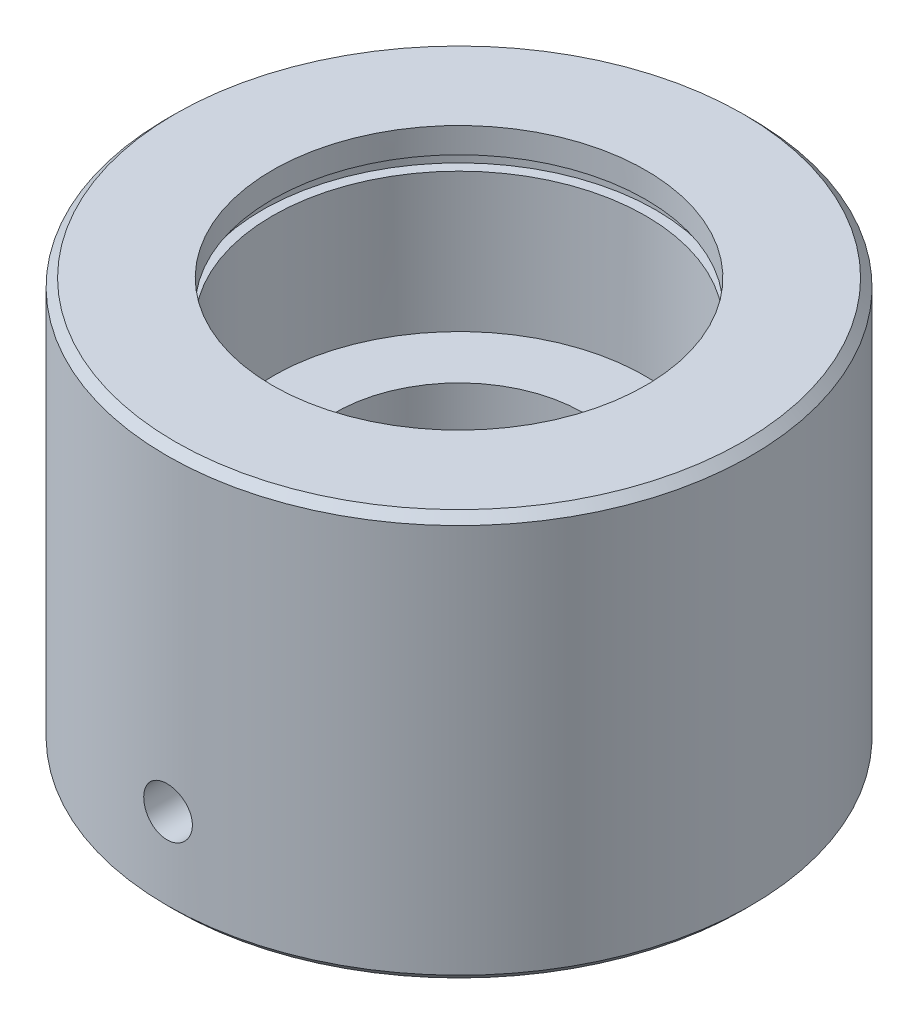
ISO-10303-21;
HEADER;
FILE_DESCRIPTION(('STEP AP214'),'2;1');
FILE_NAME('part.step','',(''),(''),'','','');
FILE_SCHEMA(('AUTOMOTIVE_DESIGN { 1 0 10303 214 1 1 1 1 }'));
ENDSEC;
DATA;
#1=APPLICATION_CONTEXT('core data for automotive mechanical design processes');
#2=APPLICATION_PROTOCOL_DEFINITION('international standard','automotive_design',2000,#1);
#3=PRODUCT_CONTEXT('',#1,'mechanical');
#4=PRODUCT('Part','Part','',(#3));
#5=PRODUCT_RELATED_PRODUCT_CATEGORY('part','',(#4));
#6=PRODUCT_DEFINITION_FORMATION('','',#4);
#7=PRODUCT_DEFINITION_CONTEXT('part definition',#1,'design');
#8=PRODUCT_DEFINITION('design','',#6,#7);
#9=PRODUCT_DEFINITION_SHAPE('','',#8);
#10=(LENGTH_UNIT() NAMED_UNIT(*) SI_UNIT(.MILLI.,.METRE.));
#11=(NAMED_UNIT(*) PLANE_ANGLE_UNIT() SI_UNIT($,.RADIAN.));
#12=(NAMED_UNIT(*) SI_UNIT($,.STERADIAN.) SOLID_ANGLE_UNIT());
#13=UNCERTAINTY_MEASURE_WITH_UNIT(LENGTH_MEASURE(1.E-05),#10,'distance_accuracy_value','');
#14=(GEOMETRIC_REPRESENTATION_CONTEXT(3) GLOBAL_UNCERTAINTY_ASSIGNED_CONTEXT((#13)) GLOBAL_UNIT_ASSIGNED_CONTEXT((#10,
#11,#12)) REPRESENTATION_CONTEXT('',''));
#15=CARTESIAN_POINT('',(0.,0.,0.));
#16=DIRECTION('',(0.,0.,1.));
#17=DIRECTION('',(1.,0.,0.));
#18=AXIS2_PLACEMENT_3D('',#15,#16,#17);
#19=CARTESIAN_POINT('',(0.,28.,0.));
#20=DIRECTION('',(0.,1.,0.));
#21=DIRECTION('',(0.,0.,1.));
#22=AXIS2_PLACEMENT_3D('',#19,#20,#21);
#23=CYLINDRICAL_SURFACE('',#22,23.);
#24=CARTESIAN_POINT('',(0.,45.125,0.));
#25=DIRECTION('',(0.,-1.,0.));
#26=DIRECTION('',(0.,0.,-1.));
#27=AXIS2_PLACEMENT_3D('',#24,#25,#26);
#28=CIRCLE('',#27,23.);
#29=CARTESIAN_POINT('',(0.,45.125,-23.));
#30=VERTEX_POINT('',#29);
#31=EDGE_CURVE('E164',#30,#30,#28,.T.);
#32=ORIENTED_EDGE('',*,*,#31,.F.);
#33=EDGE_LOOP('',(#32));
#34=FACE_BOUND('',#33,.T.);
#35=CARTESIAN_POINT('',(0.,28.,0.));
#36=DIRECTION('',(0.,1.,0.));
#37=DIRECTION('',(0.,0.,1.));
#38=AXIS2_PLACEMENT_3D('',#35,#36,#37);
#39=CIRCLE('',#38,23.);
#40=CARTESIAN_POINT('',(0.,28.,23.));
#41=VERTEX_POINT('',#40);
#42=EDGE_CURVE('E65',#41,#41,#39,.T.);
#43=ORIENTED_EDGE('',*,*,#42,.F.);
#44=EDGE_LOOP('',(#43));
#45=FACE_BOUND('',#44,.T.);
#46=ADVANCED_FACE('F41',(#34,#45),#23,.F.);
#47=CARTESIAN_POINT('',(0.,50.,0.));
#48=DIRECTION('',(0.,-1.,0.));
#49=DIRECTION('',(0.,0.,-1.));
#50=AXIS2_PLACEMENT_3D('',#47,#48,#49);
#51=CYLINDRICAL_SURFACE('',#50,36.);
#52=CARTESIAN_POINT('',(0.,0.999999999999994,0.));
#53=DIRECTION('',(0.,1.,0.));
#54=DIRECTION('',(0.,0.,1.));
#55=AXIS2_PLACEMENT_3D('',#52,#53,#54);
#56=CIRCLE('',#55,36.);
#57=CARTESIAN_POINT('',(0.,0.999999999999994,36.));
#58=VERTEX_POINT('',#57);
#59=EDGE_CURVE('E52',#58,#58,#56,.T.);
#60=ORIENTED_EDGE('',*,*,#59,.T.);
#61=EDGE_LOOP('',(#60));
#62=FACE_BOUND('',#61,.T.);
#63=CARTESIAN_POINT('',(0.,49.,0.));
#64=DIRECTION('',(0.,1.,0.));
#65=DIRECTION('',(0.,0.,1.));
#66=AXIS2_PLACEMENT_3D('',#63,#64,#65);
#67=CIRCLE('',#66,36.);
#68=CARTESIAN_POINT('',(0.,49.,36.));
#69=VERTEX_POINT('',#68);
#70=EDGE_CURVE('E60',#69,#69,#67,.F.);
#71=ORIENTED_EDGE('',*,*,#70,.T.);
#72=EDGE_LOOP('',(#71));
#73=FACE_BOUND('',#72,.T.);
#74=CARTESIAN_POINT('',(0.,14.,-36.));
#75=CARTESIAN_POINT('',(-0.168198269763613,13.9999926535212,-35.9999983623455));
#76=CARTESIAN_POINT('',(-0.336511041540677,13.9858070905669,-35.9988086563019));
#77=CARTESIAN_POINT('',(-0.668479712101169,13.9294269444348,-35.9941770698475));
#78=CARTESIAN_POINT('',(-0.832130115675691,13.8872006290853,-35.9907326379508));
#79=CARTESIAN_POINT('',(-1.14991806754278,13.7759685385719,-35.9819808373831));
#80=CARTESIAN_POINT('',(-1.30406094127385,13.7069779156705,-35.9766745229546));
#81=CARTESIAN_POINT('',(-1.59854170024823,13.544202704384,-35.9647940323414));
#82=CARTESIAN_POINT('',(-1.73888252965617,13.4504234195675,-35.9582201274407));
#83=CARTESIAN_POINT('',(-2.00216999989677,13.240474800182,-35.9445233960014));
#84=CARTESIAN_POINT('',(-2.12507661724848,13.1242553481929,-35.9373993625973));
#85=CARTESIAN_POINT('',(-2.34966340060966,12.8728313124502,-35.923415424095));
#86=CARTESIAN_POINT('',(-2.45134263411452,12.7376258950921,-35.9165555306112));
#87=CARTESIAN_POINT('',(-2.63072376717069,12.4518256487029,-35.9038635798373));
#88=CARTESIAN_POINT('',(-2.70839049885463,12.3012086737917,-35.8980330354028));
#89=CARTESIAN_POINT('',(-2.83731730132154,11.9890151133321,-35.8880737334482));
#90=CARTESIAN_POINT('',(-2.88857783853725,11.8274387214252,-35.8839449458689));
#91=CARTESIAN_POINT('',(-2.96312108945571,11.4983138243565,-35.8778667619896));
#92=CARTESIAN_POINT('',(-2.98646899616932,11.3307801800222,-35.8759122880866));
#93=CARTESIAN_POINT('',(-3.00472562404628,10.9941613881639,-35.8743879696443));
#94=CARTESIAN_POINT('',(-2.99963487893862,10.825076269817,-35.8748180803518));
#95=CARTESIAN_POINT('',(-2.96121259264454,10.4906010034684,-35.8780097208491));
#96=CARTESIAN_POINT('',(-2.92795190411417,10.3252026527708,-35.8807654013356));
#97=CARTESIAN_POINT('',(-2.83424395614882,10.0023443978211,-35.8882885070809));
#98=CARTESIAN_POINT('',(-2.77379643119035,9.84488457111844,-35.893055951988));
#99=CARTESIAN_POINT('',(-2.6273513644561,9.5421472823657,-35.9040721412056));
#100=CARTESIAN_POINT('',(-2.54132203427158,9.39688526723747,-35.9103227265289));
#101=CARTESIAN_POINT('',(-2.34617833174004,9.12283598354058,-35.9235992059164));
#102=CARTESIAN_POINT('',(-2.23706349186762,8.99404904870835,-35.9306251156809));
#103=CARTESIAN_POINT('',(-1.99844874667909,8.7561937421553,-35.9446866123493));
#104=CARTESIAN_POINT('',(-1.86888758817172,8.64718680761225,-35.951722163252));
#105=CARTESIAN_POINT('',(-1.59327166911525,8.45246082983434,-35.964989756095));
#106=CARTESIAN_POINT('',(-1.44721689754601,8.36674180215933,-35.9712217974986));
#107=CARTESIAN_POINT('',(-1.14271977980355,8.22102871199388,-35.9821813742892));
#108=CARTESIAN_POINT('',(-0.984276125427223,8.16103737056553,-35.9869087505233));
#109=CARTESIAN_POINT('',(-0.659517207058746,8.06852560264602,-35.9943245223539));
#110=CARTESIAN_POINT('',(-0.493202106506566,8.03600460603421,-35.9970129602666));
#111=CARTESIAN_POINT('',(-0.157953900492754,7.99943370787526,-36.0000425082915));
#112=CARTESIAN_POINT('',(0.0109698873455864,7.99529894567931,-36.00039061476));
#113=CARTESIAN_POINT('',(0.347108257509908,8.01539558188195,-35.998718963361));
#114=CARTESIAN_POINT('',(0.514322855764238,8.03962671568838,-35.9966992275802));
#115=CARTESIAN_POINT('',(0.842054268674097,8.11569697583028,-35.9905235352396));
#116=CARTESIAN_POINT('',(1.00258027541916,8.16749676807743,-35.9863706225226));
#117=CARTESIAN_POINT('',(1.31266249524747,8.29719376334609,-35.9763951033705));
#118=CARTESIAN_POINT('',(1.4622185348494,8.3750913789755,-35.9705724705373));
#119=CARTESIAN_POINT('',(1.74650165490572,8.55498604764907,-35.957892791809));
#120=CARTESIAN_POINT('',(1.88119305156441,8.65703931918448,-35.9510333465621));
#121=CARTESIAN_POINT('',(2.13156328453086,8.88226717115145,-35.9370587591909));
#122=CARTESIAN_POINT('',(2.24724179044315,9.0054421185478,-35.9299436126258));
#123=CARTESIAN_POINT('',(2.45659363636531,9.26978507659502,-35.9162388364746));
#124=CARTESIAN_POINT('',(2.55021159970091,9.4109970235922,-35.9096505562267));
#125=CARTESIAN_POINT('',(2.71240518851855,9.70718678859025,-35.8977645523296));
#126=CARTESIAN_POINT('',(2.78098106402989,9.86216446912981,-35.8924668157955));
#127=CARTESIAN_POINT('',(2.89104953232169,10.1812903716177,-35.8837692854682));
#128=CARTESIAN_POINT('',(2.93257602434787,10.345426834143,-35.880367116859));
#129=CARTESIAN_POINT('',(2.98747730973046,10.6783720996233,-35.8758379707255));
#130=CARTESIAN_POINT('',(3.0008526437048,10.8471808127888,-35.874710949509));
#131=CARTESIAN_POINT('',(2.99906568867279,11.1841283780627,-35.8748603385058));
#132=CARTESIAN_POINT('',(2.98399040933217,11.3522677017093,-35.8761294207921));
#133=CARTESIAN_POINT('',(2.92591158988509,11.6836176006526,-35.8809124524692));
#134=CARTESIAN_POINT('',(2.88290800718288,11.8468281684315,-35.8844264052839));
#135=CARTESIAN_POINT('',(2.77021533005119,12.1636932897999,-35.8933013139511));
#136=CARTESIAN_POINT('',(2.7005278020196,12.3173484036971,-35.8986621613857));
#137=CARTESIAN_POINT('',(2.53645517684175,12.610792521721,-35.9106269962521));
#138=CARTESIAN_POINT('',(2.44207046734367,12.75058174344,-35.9172309641714));
#139=CARTESIAN_POINT('',(2.23095582636734,13.012771217039,-35.9309619509604));
#140=CARTESIAN_POINT('',(2.11416148122438,13.135119525972,-35.9380904401723));
#141=CARTESIAN_POINT('',(1.8616596767774,13.35852555561,-35.9520538502903));
#142=CARTESIAN_POINT('',(1.72594764792327,13.459578117488,-35.9588886997447));
#143=CARTESIAN_POINT('',(1.43920131908824,13.6376595812527,-35.9715070452682));
#144=CARTESIAN_POINT('',(1.28813896881161,13.714643415969,-35.9772885606931));
#145=CARTESIAN_POINT('',(0.9752872559872,13.8420554091538,-35.987125575489));
#146=CARTESIAN_POINT('',(0.813510466240953,13.8925140928643,-35.9911830578477));
#147=CARTESIAN_POINT('',(0.542316144290038,13.9525927475061,-35.9960732320155));
#148=CARTESIAN_POINT('',(0.434642683315412,13.9703468375525,-35.9975390663086));
#149=CARTESIAN_POINT('',(0.217995514503488,13.9940528290316,-35.999502979759));
#150=CARTESIAN_POINT('',(0.109021810119135,14.0000047617994,-36.0000010614857));
#151=CARTESIAN_POINT('',(0.,14.,-36.));
#152=B_SPLINE_CURVE_WITH_KNOTS('',3,(#74,#75,#76,#77,#78,#79,#80,#81,#82,#83,#84,#85,#86,#87,
#88,#89,#90,#91,#92,#93,#94,#95,#96,#97,#98,#99,#100,#101,#102,#103,#104,#105,#106,#107,#108,
#109,#110,#111,#112,#113,#114,#115,#116,#117,#118,#119,#120,#121,#122,#123,#124,#125,#126,#127,
#128,#129,#130,#131,#132,#133,#134,#135,#136,#137,#138,#139,#140,#141,#142,#143,#144,#145,#146,
#147,#148,#149,#150,#151),.UNSPECIFIED.,.T.,.F.,(4,2,2,2,2,2,2,2,2,2,2,2,2,2,2,2,2,2,2,2,2,2,2,
2,2,2,2,2,2,2,2,2,2,2,2,2,2,2,4),(0.,0.504196760400417,1.00896506699351,1.51344802166686,
2.01782312875254,2.52333800635729,3.02887508621795,3.53514908853274,4.04141414783703,
4.54649444494759,5.05156526287857,5.55536949330869,6.05917864430997,6.56361647246698,
7.0680645174258,7.57405352805448,8.08004287675934,8.58608572771351,9.09211807597605,
9.59663697921505,10.1011511764266,10.6049474709236,11.1087517308412,11.6137402492478,
12.1187375421375,12.6249892947361,13.1312359925948,13.6368470172279,14.1424483319627,
14.6465058864758,15.1505642097702,15.6545929484257,16.1586137762957,16.6641056599392,
17.1697198569744,17.6762751918766,18.1822462977536,18.5090545906999,18.8358620159624),.UNSPECIFIED.);
#153=CARTESIAN_POINT('',(0.,14.,-36.));
#154=VERTEX_POINT('',#153);
#155=EDGE_CURVE('E98',#154,#154,#152,.T.);
#156=ORIENTED_EDGE('',*,*,#155,.T.);
#157=EDGE_LOOP('',(#156));
#158=FACE_BOUND('',#157,.T.);
#159=CARTESIAN_POINT('',(3.,11.,35.8747822293042));
#160=CARTESIAN_POINT('',(2.99999265249114,10.8318028736288,35.8747838882508));
#161=CARTESIAN_POINT('',(2.98580727587947,10.663491241527,35.8759778394786));
#162=CARTESIAN_POINT('',(2.92942793722287,10.3315249389697,35.880624592478));
#163=CARTESIAN_POINT('',(2.88720223908497,10.1678757646172,35.8840799536539));
#164=CARTESIAN_POINT('',(2.77597195421258,9.85009041162401,35.8928554648803));
#165=CARTESIAN_POINT('',(2.70698254912658,9.69594889713513,35.8981745575681));
#166=CARTESIAN_POINT('',(2.54421020545637,9.40147041437025,35.9100768810485));
#167=CARTESIAN_POINT('',(2.45043256743807,9.26113050363487,35.9166598415011));
#168=CARTESIAN_POINT('',(2.2404856093741,8.99784199080006,35.9303671433845));
#169=CARTESIAN_POINT('',(2.12426580420563,8.8749337044111,35.9374926830708));
#170=CARTESIAN_POINT('',(1.87284036202828,8.65034370128592,35.9514712983232));
#171=CARTESIAN_POINT('',(1.73763389596103,8.54866291193724,35.9583243619747));
#172=CARTESIAN_POINT('',(1.45183273592637,8.36928015603145,35.9709972152255));
#173=CARTESIAN_POINT('',(1.30121607637757,8.29161307045565,35.9768154965984));
#174=CARTESIAN_POINT('',(0.989023201496285,8.16268552664451,35.9867503131686));
#175=CARTESIAN_POINT('',(0.827447178048482,8.11142460620538,35.9908668781519));
#176=CARTESIAN_POINT('',(0.498323387843429,8.03688054843189,35.99692606358));
#177=CARTESIAN_POINT('',(0.330790488696961,8.01353218664166,35.9988737513985));
#178=CARTESIAN_POINT('',(-0.00582684566946122,7.99527439044623,36.0003929020268));
#179=CARTESIAN_POINT('',(-0.174911251978649,8.00036442719029,35.9999644090248));
#180=CARTESIAN_POINT('',(-0.509389654556448,8.03878559653811,35.9967836591637));
#181=CARTESIAN_POINT('',(-0.674791770217401,8.0720465894126,35.9940371736759));
#182=CARTESIAN_POINT('',(-0.99765739812074,8.16575645288626,35.9865359956386));
#183=CARTESIAN_POINT('',(-1.15512083481451,8.22620558216765,35.9817812839819));
#184=CARTESIAN_POINT('',(-1.45786248191057,8.3726539613557,35.9707886373688));
#185=CARTESIAN_POINT('',(-1.60312542797693,8.45868462379629,35.9645488807609));
#186=CARTESIAN_POINT('',(-1.87717600763211,8.65383116473586,35.9512873580776));
#187=CARTESIAN_POINT('',(-2.00596330694961,8.76294751149685,35.9442655761412));
#188=CARTESIAN_POINT('',(-2.24381689434569,9.00156331986575,35.930203942418));
#189=CARTESIAN_POINT('',(-2.35282204999508,9.13112372845641,35.9231641005799));
#190=CARTESIAN_POINT('',(-2.54754479676812,9.40673751534898,35.9098812531713));
#191=CARTESIAN_POINT('',(-2.63326236869495,9.55279090724651,35.9036382482578));
#192=CARTESIAN_POINT('',(-2.77897441377976,9.8572876633154,35.8926547829096));
#193=CARTESIAN_POINT('',(-2.8389657142041,10.0157325528407,35.8879145078203));
#194=CARTESIAN_POINT('',(-2.93147702108553,10.340494154153,35.8804767983994));
#195=CARTESIAN_POINT('',(-2.96399760508441,10.5068107003694,35.8777793211204));
#196=CARTESIAN_POINT('',(-3.00056694873785,10.8420595596659,35.874739586896));
#197=CARTESIAN_POINT('',(-3.00470095835366,11.0109825123407,35.8743902780472));
#198=CARTESIAN_POINT('',(-2.98460311513447,11.3471190309489,35.8760678164145));
#199=CARTESIAN_POINT('',(-2.96037152687646,11.5143326128116,35.8780946414676));
#200=CARTESIAN_POINT('',(-2.88430140372744,11.8420590673986,35.8842896443424));
#201=CARTESIAN_POINT('',(-2.83250265296835,12.0025812378893,35.8884547359741));
#202=CARTESIAN_POINT('',(-2.70280902668952,12.3126562464912,35.8984544093884));
#203=CARTESIAN_POINT('',(-2.6249137324412,12.4622089085458,35.9042890179587));
#204=CARTESIAN_POINT('',(-2.44502246393684,12.7464897566578,35.9169874038955));
#205=CARTESIAN_POINT('',(-2.34296968105511,12.8811818851953,35.9238535930022));
#206=CARTESIAN_POINT('',(-2.11774238524652,13.1315538227205,35.9378333332134));
#207=CARTESIAN_POINT('',(-1.9945675088678,13.247233304487,35.9449468885726));
#208=CARTESIAN_POINT('',(-1.73022411873523,13.4565872173101,35.9586408332648));
#209=CARTESIAN_POINT('',(-1.58901165722949,13.5502062590094,35.9652198539422));
#210=CARTESIAN_POINT('',(-1.29282057964321,13.7124017406936,35.9770837161317));
#211=CARTESIAN_POINT('',(-1.13784210114533,13.7809784309261,35.9823685705762));
#212=CARTESIAN_POINT('',(-0.818716736301111,13.8910474472482,35.9910423365805));
#213=CARTESIAN_POINT('',(-0.654581731561815,13.9325740254375,35.9944336450549));
#214=CARTESIAN_POINT('',(-0.321639537198894,13.9874759772623,35.9989479398949));
#215=CARTESIAN_POINT('',(-0.152832436073483,14.0008518837547,36.0000709691961));
#216=CARTESIAN_POINT('',(0.184116145187709,13.9990665811971,35.9999222362014));
#217=CARTESIAN_POINT('',(0.352258092634161,13.9839916944844,35.9986577179406));
#218=CARTESIAN_POINT('',(0.683613336184003,13.9259127364654,35.9938903018663));
#219=CARTESIAN_POINT('',(0.846826625592844,13.8829086272249,35.9903874010126));
#220=CARTESIAN_POINT('',(1.16369713934626,13.7702138896329,35.9815362511181));
#221=CARTESIAN_POINT('',(1.31735491836078,13.7005248119512,35.9761881093064));
#222=CARTESIAN_POINT('',(1.61080371869707,13.5364482638069,35.9642447988237));
#223=CARTESIAN_POINT('',(1.75059495925817,13.4420611839224,35.9576496498736));
#224=CARTESIAN_POINT('',(2.01278426827638,13.2309439554527,35.9439287550489));
#225=CARTESIAN_POINT('',(2.13513082795385,13.1141499339604,35.9368015288045));
#226=CARTESIAN_POINT('',(2.35853347967863,12.8616494938221,35.9228323494064));
#227=CARTESIAN_POINT('',(2.45958440834469,12.7259385017513,35.9159904657593));
#228=CARTESIAN_POINT('',(2.63766413693657,12.4391929978972,35.9033527322603));
#229=CARTESIAN_POINT('',(2.7146475703754,12.2881302499963,35.8975588664462));
#230=CARTESIAN_POINT('',(2.84205870280139,11.9752776897962,35.8876973881578));
#231=CARTESIAN_POINT('',(2.8925169327884,11.8135004527483,35.883627792069));
#232=CARTESIAN_POINT('',(2.95259429401826,11.5423073473184,35.8787222456419));
#233=CARTESIAN_POINT('',(2.97034780217531,11.4346356416643,35.8772515316716));
#234=CARTESIAN_POINT('',(2.99405302051998,11.2179919904754,35.8752809871689));
#235=CARTESIAN_POINT('',(3.00000476242246,11.1090200484356,35.8747811540275));
#236=CARTESIAN_POINT('',(3.,11.,35.8747822293042));
#237=B_SPLINE_CURVE_WITH_KNOTS('',3,(#159,#160,#161,#162,#163,#164,#165,#166,#167,#168,#169,
#170,#171,#172,#173,#174,#175,#176,#177,#178,#179,#180,#181,#182,#183,#184,#185,#186,#187,#188,
#189,#190,#191,#192,#193,#194,#195,#196,#197,#198,#199,#200,#201,#202,#203,#204,#205,#206,#207,
#208,#209,#210,#211,#212,#213,#214,#215,#216,#217,#218,#219,#220,#221,#222,#223,#224,#225,#226,
#227,#228,#229,#230,#231,#232,#233,#234,#235,#236),.UNSPECIFIED.,.T.,.F.,(4,2,2,2,2,2,2,2,2,2,2,
2,2,2,2,2,2,2,2,2,2,2,2,2,2,2,2,2,2,2,2,2,2,2,2,2,2,2,4),(0.,0.504193326151784,1.00895827415152,
1.51343731313158,2.01780856450748,2.52332793567525,3.02886938736903,3.53514174781417,
4.04140524635333,4.54648341066068,5.05155218238314,5.5553671237405,6.05918685875926,
6.56362782603015,7.06807902618743,7.57406352068417,8.0800484322812,8.58609572734442,
9.09213238305129,9.59664865289722,10.1011602169604,10.6049456510942,11.1087391690364,
11.6137293852902,12.1187282918785,12.6249819521095,13.1312305532239,13.6368368664301,
14.1424336090558,14.6464987901218,15.150564655824,15.6546012345849,16.1586298429161,
16.6641171697108,17.1697269173214,17.6762840561615,18.1822568546215,18.509059872828,
18.8358620128162),.UNSPECIFIED.);
#238=CARTESIAN_POINT('',(3.,11.,35.8747822293042));
#239=VERTEX_POINT('',#238);
#240=EDGE_CURVE('E72',#239,#239,#237,.T.);
#241=ORIENTED_EDGE('',*,*,#240,.T.);
#242=EDGE_LOOP('',(#241));
#243=FACE_BOUND('',#242,.T.);
#244=ADVANCED_FACE('F104',(#62,#73,#158,#243),#51,.T.);
#245=CARTESIAN_POINT('',(0.,50.,0.));
#246=DIRECTION('',(0.,1.,0.));
#247=DIRECTION('',(0.,0.,1.));
#248=AXIS2_PLACEMENT_3D('',#245,#246,#247);
#249=PLANE('',#248);
#250=CARTESIAN_POINT('',(0.,50.,0.));
#251=DIRECTION('',(0.,1.,0.));
#252=DIRECTION('',(0.,0.,1.));
#253=AXIS2_PLACEMENT_3D('',#250,#251,#252);
#254=CIRCLE('',#253,35.);
#255=CARTESIAN_POINT('',(0.,50.,35.));
#256=VERTEX_POINT('',#255);
#257=EDGE_CURVE('E10',#256,#256,#254,.T.);
#258=ORIENTED_EDGE('',*,*,#257,.T.);
#259=EDGE_LOOP('',(#258));
#260=FACE_BOUND('',#259,.T.);
#261=CARTESIAN_POINT('',(0.,50.,0.));
#262=DIRECTION('',(0.,1.,0.));
#263=DIRECTION('',(0.,0.,1.));
#264=AXIS2_PLACEMENT_3D('',#261,#262,#263);
#265=CIRCLE('',#264,23.);
#266=CARTESIAN_POINT('',(0.,50.,23.));
#267=VERTEX_POINT('',#266);
#268=EDGE_CURVE('E149',#267,#267,#265,.T.);
#269=ORIENTED_EDGE('',*,*,#268,.F.);
#270=EDGE_LOOP('',(#269));
#271=FACE_BOUND('',#270,.T.);
#272=ADVANCED_FACE('F110',(#260,#271),#249,.T.);
#273=CARTESIAN_POINT('',(0.,0.,0.));
#274=DIRECTION('',(0.,1.,0.));
#275=DIRECTION('',(0.,0.,1.));
#276=AXIS2_PLACEMENT_3D('',#273,#274,#275);
#277=PLANE('',#276);
#278=CARTESIAN_POINT('',(0.,0.,0.));
#279=DIRECTION('',(0.,1.,0.));
#280=DIRECTION('',(0.,0.,1.));
#281=AXIS2_PLACEMENT_3D('',#278,#279,#280);
#282=CIRCLE('',#281,35.);
#283=CARTESIAN_POINT('',(0.,0.,35.));
#284=VERTEX_POINT('',#283);
#285=EDGE_CURVE('E47',#284,#284,#282,.F.);
#286=ORIENTED_EDGE('',*,*,#285,.T.);
#287=EDGE_LOOP('',(#286));
#288=FACE_BOUND('',#287,.T.);
#289=CARTESIAN_POINT('',(0.,0.,0.));
#290=DIRECTION('',(0.,-1.,0.));
#291=DIRECTION('',(0.,0.,-1.));
#292=AXIS2_PLACEMENT_3D('',#289,#290,#291);
#293=CIRCLE('',#292,14.);
#294=CARTESIAN_POINT('',(0.,0.,-14.));
#295=VERTEX_POINT('',#294);
#296=EDGE_CURVE('E148',#295,#295,#293,.T.);
#297=ORIENTED_EDGE('',*,*,#296,.F.);
#298=EDGE_LOOP('',(#297));
#299=FACE_BOUND('',#298,.T.);
#300=ADVANCED_FACE('F113',(#288,#299),#277,.F.);
#301=CARTESIAN_POINT('',(0.,46.875,0.));
#302=DIRECTION('',(0.,-1.,0.));
#303=DIRECTION('',(0.,0.,-1.));
#304=AXIS2_PLACEMENT_3D('',#301,#302,#303);
#305=CIRCLE('',#304,23.);
#306=CARTESIAN_POINT('',(0.,46.875,-23.));
#307=VERTEX_POINT('',#306);
#308=EDGE_CURVE('E144',#307,#307,#305,.T.);
#309=ORIENTED_EDGE('',*,*,#308,.T.);
#310=EDGE_LOOP('',(#309));
#311=FACE_BOUND('',#310,.T.);
#312=ORIENTED_EDGE('',*,*,#268,.T.);
#313=EDGE_LOOP('',(#312));
#314=FACE_BOUND('',#313,.T.);
#315=ADVANCED_FACE('F127',(#311,#314),#23,.F.);
#316=CARTESIAN_POINT('',(0.,28.,0.));
#317=DIRECTION('',(0.,1.,0.));
#318=DIRECTION('',(0.,0.,1.));
#319=AXIS2_PLACEMENT_3D('',#316,#317,#318);
#320=PLANE('',#319);
#321=CARTESIAN_POINT('',(0.,28.,0.));
#322=DIRECTION('',(0.,1.,0.));
#323=DIRECTION('',(0.,0.,1.));
#324=AXIS2_PLACEMENT_3D('',#321,#322,#323);
#325=CIRCLE('',#324,15.25);
#326=CARTESIAN_POINT('',(0.,28.,15.25));
#327=VERTEX_POINT('',#326);
#328=EDGE_CURVE('E158',#327,#327,#325,.T.);
#329=ORIENTED_EDGE('',*,*,#328,.F.);
#330=EDGE_LOOP('',(#329));
#331=FACE_BOUND('',#330,.T.);
#332=ORIENTED_EDGE('',*,*,#42,.T.);
#333=EDGE_LOOP('',(#332));
#334=FACE_BOUND('',#333,.T.);
#335=ADVANCED_FACE('F133',(#331,#334),#320,.T.);
#336=CARTESIAN_POINT('',(0.,22.,0.));
#337=DIRECTION('',(0.,-1.,0.));
#338=DIRECTION('',(0.,0.,-1.));
#339=AXIS2_PLACEMENT_3D('',#336,#337,#338);
#340=CYLINDRICAL_SURFACE('',#339,14.);
#341=CARTESIAN_POINT('',(0.,14.,-14.));
#342=CARTESIAN_POINT('',(0.166471772181233,13.9999942008514,-13.9999969208645));
#343=CARTESIAN_POINT('',(0.333014391200549,13.9860967832243,-13.9970005189942));
#344=CARTESIAN_POINT('',(0.661374688586654,13.9309286862928,-13.9853365965546));
#345=CARTESIAN_POINT('',(0.82318880714238,13.8896379116101,-13.976664912742));
#346=CARTESIAN_POINT('',(1.13729864763547,13.7810312707839,-13.9546166357765));
#347=CARTESIAN_POINT('',(1.28960392689311,13.7137420412374,-13.9412448593434));
#348=CARTESIAN_POINT('',(1.58075635592157,13.5551318276575,-13.9112421363594));
#349=CARTESIAN_POINT('',(1.71960396349474,13.4638116615001,-13.8946113007332));
#350=CARTESIAN_POINT('',(1.98204958107046,13.258239400653,-13.8596273849262));
#351=CARTESIAN_POINT('',(2.1054100683889,13.1436875562029,-13.8412536628652));
#352=CARTESIAN_POINT('',(2.3313208477887,12.8955473686296,-13.8050013962829));
#353=CARTESIAN_POINT('',(2.43386934301816,12.7619573834975,-13.7871228946326));
#354=CARTESIAN_POINT('',(2.61628408759617,12.4777884942791,-13.7536823209445));
#355=CARTESIAN_POINT('',(2.69589916670017,12.3270449644876,-13.7381467268872));
#356=CARTESIAN_POINT('',(2.82857647382295,12.0139310924663,-13.7114465111707));
#357=CARTESIAN_POINT('',(2.88164174003431,11.8515620830149,-13.7002813894142));
#358=CARTESIAN_POINT('',(2.95893148844909,11.5223778268239,-13.6837961785262));
#359=CARTESIAN_POINT('',(2.98357559496685,11.3556654486723,-13.6783911379297));
#360=CARTESIAN_POINT('',(3.00462790413154,11.020391534986,-13.6737827969021));
#361=CARTESIAN_POINT('',(3.00103943329259,10.8518302196401,-13.6745787658346));
#362=CARTESIAN_POINT('',(2.96606652681723,10.5207506241324,-13.6822055320766));
#363=CARTESIAN_POINT('',(2.93516797298817,10.3581782217997,-13.6889308336432));
#364=CARTESIAN_POINT('',(2.84722108597354,10.0405795194213,-13.7074918675158));
#365=CARTESIAN_POINT('',(2.79017133872931,9.88555362793536,-13.719327876168));
#366=CARTESIAN_POINT('',(2.65109102151982,9.58607425425332,-13.7468816151145));
#367=CARTESIAN_POINT('',(2.5688722194566,9.4417109745749,-13.7626284196673));
#368=CARTESIAN_POINT('',(2.38192014567986,9.16864967008408,-13.7962114500258));
#369=CARTESIAN_POINT('',(2.27718392207124,9.0399537026276,-13.8140479496379));
#370=CARTESIAN_POINT('',(2.04559085510641,8.7990812886532,-13.8502543678776));
#371=CARTESIAN_POINT('',(1.91832046792882,8.68730258683052,-13.8686276794436));
#372=CARTESIAN_POINT('',(1.64663461253819,8.48661253262068,-13.9035003499412));
#373=CARTESIAN_POINT('',(1.5022188575508,8.39770156279922,-13.9199996775194));
#374=CARTESIAN_POINT('',(1.19986692409992,8.24517864018614,-13.9493155706801));
#375=CARTESIAN_POINT('',(1.04190451772696,8.18161717484403,-13.9621247728671));
#376=CARTESIAN_POINT('',(0.717206293371413,8.08204870335783,-13.9825621849067));
#377=CARTESIAN_POINT('',(0.550471702267338,8.04603785487337,-13.9901911172077));
#378=CARTESIAN_POINT('',(0.216375341673258,8.00316757171315,-13.9993061269562));
#379=CARTESIAN_POINT('',(0.0490863545432298,7.99576457423644,-14.0009067304213));
#380=CARTESIAN_POINT('',(-0.284337947300809,8.00884914225033,-13.9981049787194));
#381=CARTESIAN_POINT('',(-0.45047333625451,8.02933489592588,-13.993703013514));
#382=CARTESIAN_POINT('',(-0.775085075965612,8.0971644873234,-13.9794628609053));
#383=CARTESIAN_POINT('',(-0.933623425816955,8.14422473894507,-13.9696821009092));
#384=CARTESIAN_POINT('',(-1.24055690094684,8.26355388598964,-13.9457784884302));
#385=CARTESIAN_POINT('',(-1.38895118517548,8.33582486862331,-13.9316552764447));
#386=CARTESIAN_POINT('',(-1.67364279592951,8.50466708612065,-13.900350087808));
#387=CARTESIAN_POINT('',(-1.80974515022228,8.60155958981946,-13.8831286270855));
#388=CARTESIAN_POINT('',(-2.06395385104719,8.81646964977747,-13.8476206606969));
#389=CARTESIAN_POINT('',(-2.18205795738399,8.93448983177488,-13.8293340228419));
#390=CARTESIAN_POINT('',(-2.39905422115978,9.19079474037427,-13.7933634541265));
#391=CARTESIAN_POINT('',(-2.49757074510313,9.32940019844421,-13.7756958444257));
#392=CARTESIAN_POINT('',(-2.66992830772081,9.62150919295599,-13.7433330911936));
#393=CARTESIAN_POINT('',(-2.74377039827411,9.77501209395498,-13.7286378209611));
#394=CARTESIAN_POINT('',(-2.86419482497096,10.0917445979892,-13.7040201961478));
#395=CARTESIAN_POINT('',(-2.9109279728255,10.2549147128613,-13.6940714916593));
#396=CARTESIAN_POINT('',(-2.97625392170671,10.5870311676673,-13.6800237341684));
#397=CARTESIAN_POINT('',(-2.99485101560515,10.7559766224026,-13.6759237887941));
#398=CARTESIAN_POINT('',(-3.00319999852081,11.0910646863505,-13.6740923769631));
#399=CARTESIAN_POINT('',(-2.99354694516622,11.2571920299612,-13.6762295303709));
#400=CARTESIAN_POINT('',(-2.94699578812661,11.5853944842652,-13.6863352636966));
#401=CARTESIAN_POINT('',(-2.91009797915958,11.7474696387731,-13.6943037805343));
#402=CARTESIAN_POINT('',(-2.81038691880867,12.0625173157383,-13.7151116220831));
#403=CARTESIAN_POINT('',(-2.74765694341773,12.2155172973286,-13.7279352844941));
#404=CARTESIAN_POINT('',(-2.59813503191201,12.5089107450137,-13.757015291813));
#405=CARTESIAN_POINT('',(-2.51134070602999,12.6493029572301,-13.7732719776073));
#406=CARTESIAN_POINT('',(-2.31416580698607,12.9164363874507,-13.8077811118646));
#407=CARTESIAN_POINT('',(-2.20335974842473,13.042859391894,-13.8260661987785));
#408=CARTESIAN_POINT('',(-1.96217310923924,13.2755125250409,-13.8623489959939));
#409=CARTESIAN_POINT('',(-1.83178801877119,13.3817379886244,-13.8803466390259));
#410=CARTESIAN_POINT('',(-1.55320629453743,13.5722319190111,-13.9142898209797));
#411=CARTESIAN_POINT('',(-1.40480969201928,13.656213212462,-13.9302072914125));
#412=CARTESIAN_POINT('',(-1.0957003218812,13.7979090578124,-13.9579165220804));
#413=CARTESIAN_POINT('',(-0.93499821172776,13.8556460451701,-13.9697118042469));
#414=CARTESIAN_POINT('',(-0.645070435106408,13.9327043702623,-13.9856969692354));
#415=CARTESIAN_POINT('',(-0.517434411091959,13.9578928679601,-13.9910278377653));
#416=CARTESIAN_POINT('',(-0.259879921707693,13.9915426034233,-13.9981804830944));
#417=CARTESIAN_POINT('',(-0.12996155017749,14.0000045272921,-14.0000024038263));
#418=CARTESIAN_POINT('',(0.,14.,-14.));
#419=B_SPLINE_CURVE_WITH_KNOTS('',3,(#341,#342,#343,#344,#345,#346,#347,#348,#349,#350,#351,
#352,#353,#354,#355,#356,#357,#358,#359,#360,#361,#362,#363,#364,#365,#366,#367,#368,#369,#370,
#371,#372,#373,#374,#375,#376,#377,#378,#379,#380,#381,#382,#383,#384,#385,#386,#387,#388,#389,
#390,#391,#392,#393,#394,#395,#396,#397,#398,#399,#400,#401,#402,#403,#404,#405,#406,#407,#408,
#409,#410,#411,#412,#413,#414,#415,#416,#417,#418),.UNSPECIFIED.,.T.,.F.,(4,2,2,2,2,2,2,2,2,2,2,
2,2,2,2,2,2,2,2,2,2,2,2,2,2,2,2,2,2,2,2,2,2,2,2,2,2,2,4),(0.,0.498939673024164,
0.998245766439872,1.4970416488512,1.99582055729177,2.50149923763464,3.00722155837013,
3.51828858429021,4.02929711354979,4.53266016249331,5.0359639033833,5.53048950905855,
6.02504185809136,6.52338712331935,7.02179775841779,7.53054022100582,8.039291194047,
8.54905042279612,9.05873854512687,9.5586933140837,10.0586156046286,10.5533012117853,
11.0480277839687,11.5495746773561,12.0511839460897,12.5616412656707,13.0720768215161,
13.5796448081695,14.0871353445837,14.5840136108059,15.0808865021654,15.5761699941357,
16.0715026890325,16.5764590030823,17.0815318079423,17.5928382071444,18.1037066802054,
18.4932359826459,18.8827493067467),.UNSPECIFIED.);
#420=CARTESIAN_POINT('',(0.,14.,-14.));
#421=VERTEX_POINT('',#420);
#422=EDGE_CURVE('E64',#421,#421,#419,.T.);
#423=ORIENTED_EDGE('',*,*,#422,.T.);
#424=EDGE_LOOP('',(#423));
#425=FACE_BOUND('',#424,.T.);
#426=CARTESIAN_POINT('',(3.,11.,13.6747943311773));
#427=CARTESIAN_POINT('',(2.99999416477353,11.166422304966,13.6747976912119));
#428=CARTESIAN_POINT('',(2.9861047248957,11.3329155478848,13.6778654468474));
#429=CARTESIAN_POINT('',(2.93097118505965,11.6611733444834,13.6897835685885));
#430=CARTESIAN_POINT('',(2.88970679307235,11.8229342973523,13.6986382242345));
#431=CARTESIAN_POINT('',(2.78117727369208,12.1369314991486,13.7210823058705));
#432=CARTESIAN_POINT('',(2.71394001982631,12.289177756243,13.7346666545171));
#433=CARTESIAN_POINT('',(2.55545235346679,12.5802305478892,13.7650334169723));
#434=CARTESIAN_POINT('',(2.46420264097551,12.7190374740581,13.7818157375507));
#435=CARTESIAN_POINT('',(2.25870285140442,12.9815259229643,13.8169915759332));
#436=CARTESIAN_POINT('',(2.14413718967966,13.1049577524799,13.8354049974351));
#437=CARTESIAN_POINT('',(1.89593901625915,13.3310071088116,13.8715938342079));
#438=CARTESIAN_POINT('',(1.76230506043535,13.4336230577201,13.8893692010283));
#439=CARTESIAN_POINT('',(1.47809457692916,13.6161108889829,13.9224953821886));
#440=CARTESIAN_POINT('',(1.32736097645991,13.6957433115412,13.9378199763886));
#441=CARTESIAN_POINT('',(1.01426853868519,13.8284553828926,13.9640934208587));
#442=CARTESIAN_POINT('',(0.851910954760623,13.8815378895726,13.9750427420666));
#443=CARTESIAN_POINT('',(0.522774375343023,13.9588599418627,13.9911913056236));
#444=CARTESIAN_POINT('',(0.356098801193846,13.9835218571049,13.9964746675677));
#445=CARTESIAN_POINT('',(0.0208978906132889,14.0046225546265,14.00098724414));
#446=CARTESIAN_POINT('',(-0.147627240329519,14.0010644411215,14.000217124654));
#447=CARTESIAN_POINT('',(-0.478834058501024,13.9661420706728,13.9927740172512));
#448=CARTESIAN_POINT('',(-0.641566230724225,13.9352329994202,13.9861976630486));
#449=CARTESIAN_POINT('',(-0.959478927956778,13.8472106362963,13.9679908317821));
#450=CARTESIAN_POINT('',(-1.11465912035011,13.7900961914005,13.9563601323304));
#451=CARTESIAN_POINT('',(-1.41433499511311,13.650877082223,13.9291950929372));
#452=CARTESIAN_POINT('',(-1.55874731403158,13.5685984655913,13.9136337160789));
#453=CARTESIAN_POINT('',(-1.83188185312569,13.3815160636728,13.8803158748773));
#454=CARTESIAN_POINT('',(-1.96060201290306,13.2767093253994,13.8625591228939));
#455=CARTESIAN_POINT('',(-2.20140417600396,13.0450629109443,13.8263865292185));
#456=CARTESIAN_POINT('',(-2.31310234640501,12.9178248412859,13.8079646074571));
#457=CARTESIAN_POINT('',(-2.51364486469456,12.646233429863,13.7728713366395));
#458=CARTESIAN_POINT('',(-2.60248864236137,12.5018796611895,13.7562000312677));
#459=CARTESIAN_POINT('',(-2.75496155146593,12.1995509978725,13.7264804717345));
#460=CARTESIAN_POINT('',(-2.81852070177845,12.0415397522951,13.7134423025555));
#461=CARTESIAN_POINT('',(-2.91806990318231,11.7167344681071,13.6926068161323));
#462=CARTESIAN_POINT('',(-2.95406413389256,11.5499417651136,13.6848087043697));
#463=CARTESIAN_POINT('',(-2.99687172049304,11.2158084947006,13.6754976251089));
#464=CARTESIAN_POINT('',(-3.0042428385728,11.0485426498454,13.673864541034));
#465=CARTESIAN_POINT('',(-2.99110279284747,10.7151720136366,13.6767447914799));
#466=CARTESIAN_POINT('',(-2.9705934616327,10.5490671466929,13.6812577220213));
#467=CARTESIAN_POINT('',(-2.90275789271168,10.2246591300385,13.6958083096841));
#468=CARTESIAN_POINT('',(-2.85573660503107,10.0662891348061,13.7057831054873));
#469=CARTESIAN_POINT('',(-2.73654105893499,9.75967532493416,13.7300771973955));
#470=CARTESIAN_POINT('',(-2.66436447325636,9.61143244873161,13.744396895457));
#471=CARTESIAN_POINT('',(-2.4956700883341,9.32686063048216,13.7760326816069));
#472=CARTESIAN_POINT('',(-2.39880737181584,9.19074083597563,13.7933900349263));
#473=CARTESIAN_POINT('',(-2.18394367667201,8.93648330825241,13.8290355072028));
#474=CARTESIAN_POINT('',(-2.06594018364322,8.81834771710307,13.8473237366892));
#475=CARTESIAN_POINT('',(-1.80962552884163,8.60125939411048,13.8831647998035));
#476=CARTESIAN_POINT('',(-1.67098985165754,8.50268616768597,13.9006987121549));
#477=CARTESIAN_POINT('',(-1.37880296256455,8.3302291812979,13.932712214298));
#478=CARTESIAN_POINT('',(-1.22525243208748,8.25634429405434,13.9471919435339));
#479=CARTESIAN_POINT('',(-0.908530837964077,8.13589589072304,13.9713855676315));
#480=CARTESIAN_POINT('',(-0.745426386150343,8.08916339250744,13.9811288760739));
#481=CARTESIAN_POINT('',(-0.413450354006573,8.02381658853536,13.9948787860397));
#482=CARTESIAN_POINT('',(-0.244579579947975,8.00519836805219,13.9988861862461));
#483=CARTESIAN_POINT('',(0.0905274341056529,7.99677869517627,14.000690220181));
#484=CARTESIAN_POINT('',(0.256749011018433,8.0064096827907,13.9986091800327));
#485=CARTESIAN_POINT('',(0.585145876831952,8.05294952703811,13.9887310472683));
#486=CARTESIAN_POINT('',(0.747321232810678,8.08985793115682,13.9809340494761));
#487=CARTESIAN_POINT('',(1.06260389697444,8.1896376124988,13.9605077727683));
#488=CARTESIAN_POINT('',(1.21573673014596,8.25243137877043,13.9478929286009));
#489=CARTESIAN_POINT('',(1.50936991344683,8.40212254233893,13.9191807210221));
#490=CARTESIAN_POINT('',(1.64986908959375,8.48902217661461,13.9030830344402));
#491=CARTESIAN_POINT('',(1.917024613789,8.68632463748275,13.8687961986559));
#492=CARTESIAN_POINT('',(2.04338073020593,8.79712831663284,13.8505741780296));
#493=CARTESIAN_POINT('',(2.27590002915847,9.03828122051049,13.8142738016446));
#494=CARTESIAN_POINT('',(2.38205836126942,9.16863512674778,13.7961954813912));
#495=CARTESIAN_POINT('',(2.57246523191562,9.44718098633924,13.761973872554));
#496=CARTESIAN_POINT('',(2.65641795611844,9.59557871644545,13.7458581173137));
#497=CARTESIAN_POINT('',(2.79806009312271,9.90468744171683,13.7177299427787));
#498=CARTESIAN_POINT('',(2.8557721284606,10.0653876904719,13.7057139912142));
#499=CARTESIAN_POINT('',(2.93277214244341,10.3552522623923,13.6894112131582));
#500=CARTESIAN_POINT('',(2.95793505015818,10.4828233514212,13.683965661845));
#501=CARTESIAN_POINT('',(2.99155088086543,10.7402486231491,13.6766559900021));
#502=CARTESIAN_POINT('',(3.00000455455863,10.870102703015,13.6747917085757));
#503=CARTESIAN_POINT('',(3.,11.,13.6747943311773));
#504=B_SPLINE_CURVE_WITH_KNOTS('',3,(#426,#427,#428,#429,#430,#431,#432,#433,#434,#435,#436,
#437,#438,#439,#440,#441,#442,#443,#444,#445,#446,#447,#448,#449,#450,#451,#452,#453,#454,#455,
#456,#457,#458,#459,#460,#461,#462,#463,#464,#465,#466,#467,#468,#469,#470,#471,#472,#473,#474,
#475,#476,#477,#478,#479,#480,#481,#482,#483,#484,#485,#486,#487,#488,#489,#490,#491,#492,#493,
#494,#495,#496,#497,#498,#499,#500,#501,#502,#503),.UNSPECIFIED.,.T.,.F.,(4,2,2,2,2,2,2,2,2,2,2,
2,2,2,2,2,2,2,2,2,2,2,2,2,2,2,2,2,2,2,2,2,2,2,2,2,2,2,4),(0.,0.498790964055057,
0.997952076959928,1.49657898230552,1.99519135347057,2.50106459165384,3.00697616225757,
3.51798269640557,4.02893421292535,4.53219016303857,5.03539075554482,5.53037115334743,
6.02537333215168,6.52387776286874,7.0224475774463,7.5309792155859,8.03952354046184,
8.54946574823562,9.05933061907677,9.55920866385046,10.0590538530783,10.5532636149875,
11.047519111263,11.5491002043264,12.0507409931816,12.5613242936642,13.0718842775108,
13.5792317964875,14.0865086641708,14.5836639928825,15.080811074302,15.5764801923897,
16.0721953230273,16.5769782832193,17.0818823126246,17.593207603363,18.1040912322742,
18.4934291224859,18.8827495204009),.UNSPECIFIED.);
#505=CARTESIAN_POINT('',(3.,11.,13.6747943311773));
#506=VERTEX_POINT('',#505);
#507=EDGE_CURVE('E75',#506,#506,#504,.T.);
#508=ORIENTED_EDGE('',*,*,#507,.T.);
#509=EDGE_LOOP('',(#508));
#510=FACE_BOUND('',#509,.T.);
#511=CARTESIAN_POINT('',(0.,22.,0.));
#512=DIRECTION('',(0.,-1.,0.));
#513=DIRECTION('',(0.,0.,-1.));
#514=AXIS2_PLACEMENT_3D('',#511,#512,#513);
#515=CIRCLE('',#514,14.);
#516=CARTESIAN_POINT('',(0.,22.,-14.));
#517=VERTEX_POINT('',#516);
#518=EDGE_CURVE('E152',#517,#517,#515,.T.);
#519=ORIENTED_EDGE('',*,*,#518,.F.);
#520=EDGE_LOOP('',(#519));
#521=FACE_BOUND('',#520,.T.);
#522=ORIENTED_EDGE('',*,*,#296,.T.);
#523=EDGE_LOOP('',(#522));
#524=FACE_BOUND('',#523,.T.);
#525=ADVANCED_FACE('F80',(#425,#510,#521,#524),#340,.F.);
#526=CARTESIAN_POINT('',(0.,22.,0.));
#527=DIRECTION('',(0.,1.,0.));
#528=DIRECTION('',(0.,0.,1.));
#529=AXIS2_PLACEMENT_3D('',#526,#527,#528);
#530=PLANE('',#529);
#531=CARTESIAN_POINT('',(0.,22.,0.));
#532=DIRECTION('',(0.,1.,0.));
#533=DIRECTION('',(0.,0.,1.));
#534=AXIS2_PLACEMENT_3D('',#531,#532,#533);
#535=CIRCLE('',#534,15.25);
#536=CARTESIAN_POINT('',(0.,22.,15.25));
#537=VERTEX_POINT('',#536);
#538=EDGE_CURVE('E159',#537,#537,#535,.T.);
#539=ORIENTED_EDGE('',*,*,#538,.T.);
#540=EDGE_LOOP('',(#539));
#541=FACE_BOUND('',#540,.T.);
#542=ORIENTED_EDGE('',*,*,#518,.T.);
#543=EDGE_LOOP('',(#542));
#544=FACE_BOUND('',#543,.T.);
#545=ADVANCED_FACE('F195',(#541,#544),#530,.T.);
#546=CARTESIAN_POINT('',(0.,22.,0.));
#547=DIRECTION('',(0.,1.,0.));
#548=DIRECTION('',(0.,0.,1.));
#549=AXIS2_PLACEMENT_3D('',#546,#547,#548);
#550=CYLINDRICAL_SURFACE('',#549,15.25);
#551=ORIENTED_EDGE('',*,*,#538,.F.);
#552=EDGE_LOOP('',(#551));
#553=FACE_BOUND('',#552,.T.);
#554=ORIENTED_EDGE('',*,*,#328,.T.);
#555=EDGE_LOOP('',(#554));
#556=FACE_BOUND('',#555,.T.);
#557=ADVANCED_FACE('F199',(#553,#556),#550,.F.);
#558=CARTESIAN_POINT('',(23.,45.125,0.));
#559=DIRECTION('',(0.,-1.,0.));
#560=DIRECTION('',(0.,0.,-1.));
#561=AXIS2_PLACEMENT_3D('',#558,#559,#560);
#562=PLANE('',#561);
#563=CARTESIAN_POINT('',(0.,45.125,0.));
#564=DIRECTION('',(0.,-1.,0.));
#565=DIRECTION('',(0.,0.,-1.));
#566=AXIS2_PLACEMENT_3D('',#563,#564,#565);
#567=CIRCLE('',#566,24.25);
#568=CARTESIAN_POINT('',(0.,45.125,-24.25));
#569=VERTEX_POINT('',#568);
#570=EDGE_CURVE('E168',#569,#569,#567,.T.);
#571=ORIENTED_EDGE('',*,*,#570,.F.);
#572=EDGE_LOOP('',(#571));
#573=FACE_BOUND('',#572,.T.);
#574=ORIENTED_EDGE('',*,*,#31,.T.);
#575=EDGE_LOOP('',(#574));
#576=FACE_BOUND('',#575,.T.);
#577=ADVANCED_FACE('F204',(#573,#576),#562,.F.);
#578=CARTESIAN_POINT('',(0.,0.,0.));
#579=DIRECTION('',(0.,-1.,0.));
#580=DIRECTION('',(0.,0.,-1.));
#581=AXIS2_PLACEMENT_3D('',#578,#579,#580);
#582=CYLINDRICAL_SURFACE('',#581,24.25);
#583=CARTESIAN_POINT('',(0.,46.875,0.));
#584=DIRECTION('',(0.,-1.,0.));
#585=DIRECTION('',(0.,0.,-1.));
#586=AXIS2_PLACEMENT_3D('',#583,#584,#585);
#587=CIRCLE('',#586,24.25);
#588=CARTESIAN_POINT('',(0.,46.875,-24.25));
#589=VERTEX_POINT('',#588);
#590=EDGE_CURVE('E172',#589,#589,#587,.T.);
#591=ORIENTED_EDGE('',*,*,#590,.F.);
#592=EDGE_LOOP('',(#591));
#593=FACE_BOUND('',#592,.T.);
#594=ORIENTED_EDGE('',*,*,#570,.T.);
#595=EDGE_LOOP('',(#594));
#596=FACE_BOUND('',#595,.T.);
#597=ADVANCED_FACE('F188',(#593,#596),#582,.F.);
#598=CARTESIAN_POINT('',(23.,46.875,0.));
#599=DIRECTION('',(0.,1.,0.));
#600=DIRECTION('',(0.,0.,1.));
#601=AXIS2_PLACEMENT_3D('',#598,#599,#600);
#602=PLANE('',#601);
#603=ORIENTED_EDGE('',*,*,#308,.F.);
#604=EDGE_LOOP('',(#603));
#605=FACE_BOUND('',#604,.T.);
#606=ORIENTED_EDGE('',*,*,#590,.T.);
#607=EDGE_LOOP('',(#606));
#608=FACE_BOUND('',#607,.T.);
#609=ADVANCED_FACE('F89',(#605,#608),#602,.F.);
#610=CARTESIAN_POINT('',(0.,11.,-36.));
#611=DIRECTION('',(0.,0.,1.));
#612=DIRECTION('',(1.,0.,0.));
#613=AXIS2_PLACEMENT_3D('',#610,#611,#612);
#614=CYLINDRICAL_SURFACE('',#613,3.);
#615=ORIENTED_EDGE('',*,*,#507,.F.);
#616=EDGE_LOOP('',(#615));
#617=FACE_BOUND('',#616,.T.);
#618=ORIENTED_EDGE('',*,*,#240,.F.);
#619=EDGE_LOOP('',(#618));
#620=FACE_BOUND('',#619,.T.);
#621=ADVANCED_FACE('F87',(#617,#620),#614,.F.);
#622=ORIENTED_EDGE('',*,*,#422,.F.);
#623=EDGE_LOOP('',(#622));
#624=FACE_BOUND('',#623,.T.);
#625=ORIENTED_EDGE('',*,*,#155,.F.);
#626=EDGE_LOOP('',(#625));
#627=FACE_BOUND('',#626,.T.);
#628=ADVANCED_FACE('F82',(#624,#627),#614,.F.);
#629=CARTESIAN_POINT('',(0.,0.999999999999994,0.));
#630=DIRECTION('',(0.,1.,0.));
#631=DIRECTION('',(0.,0.,1.));
#632=AXIS2_PLACEMENT_3D('',#629,#630,#631);
#633=CONICAL_SURFACE('',#632,36.,0.785398163397448);
#634=ORIENTED_EDGE('',*,*,#285,.F.);
#635=EDGE_LOOP('',(#634));
#636=FACE_BOUND('',#635,.T.);
#637=ORIENTED_EDGE('',*,*,#59,.F.);
#638=EDGE_LOOP('',(#637));
#639=FACE_BOUND('',#638,.T.);
#640=ADVANCED_FACE('F83',(#636,#639),#633,.T.);
#641=CARTESIAN_POINT('',(0.,50.,0.));
#642=DIRECTION('',(0.,-1.,0.));
#643=DIRECTION('',(0.,0.,-1.));
#644=AXIS2_PLACEMENT_3D('',#641,#642,#643);
#645=CONICAL_SURFACE('',#644,35.,0.785398163397441);
#646=ORIENTED_EDGE('',*,*,#70,.F.);
#647=EDGE_LOOP('',(#646));
#648=FACE_BOUND('',#647,.T.);
#649=ORIENTED_EDGE('',*,*,#257,.F.);
#650=EDGE_LOOP('',(#649));
#651=FACE_BOUND('',#650,.T.);
#652=ADVANCED_FACE('F42',(#648,#651),#645,.T.);
#653=CLOSED_SHELL('',(#46,#244,#272,#300,#315,#335,#525,#545,#557,#577,#597,#609,#621,#628,#640,#652));
#654=MANIFOLD_SOLID_BREP('B2',#653);
#655=ADVANCED_BREP_SHAPE_REPRESENTATION('',(#18,#654),#14);
#656=SHAPE_DEFINITION_REPRESENTATION(#9,#655);
ENDSEC;
END-ISO-10303-21;
